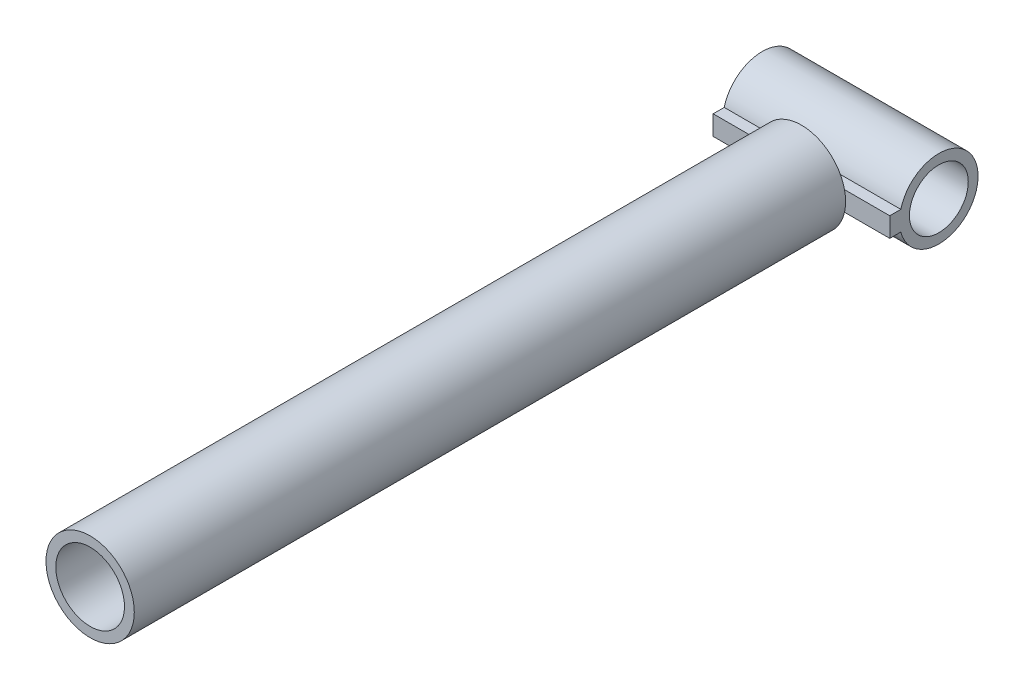
ISO-10303-21;
HEADER;
FILE_DESCRIPTION(('STEP AP214'),'2;1');
FILE_NAME('part.step','',(''),(''),'','','');
FILE_SCHEMA(('AUTOMOTIVE_DESIGN { 1 0 10303 214 1 1 1 1 }'));
ENDSEC;
DATA;
#1=APPLICATION_CONTEXT('core data for automotive mechanical design processes');
#2=APPLICATION_PROTOCOL_DEFINITION('international standard','automotive_design',2000,#1);
#3=PRODUCT_CONTEXT('',#1,'mechanical');
#4=PRODUCT('Part','Part','',(#3));
#5=PRODUCT_RELATED_PRODUCT_CATEGORY('part','',(#4));
#6=PRODUCT_DEFINITION_FORMATION('','',#4);
#7=PRODUCT_DEFINITION_CONTEXT('part definition',#1,'design');
#8=PRODUCT_DEFINITION('design','',#6,#7);
#9=PRODUCT_DEFINITION_SHAPE('','',#8);
#10=(LENGTH_UNIT() NAMED_UNIT(*) SI_UNIT(.MILLI.,.METRE.));
#11=(NAMED_UNIT(*) PLANE_ANGLE_UNIT() SI_UNIT($,.RADIAN.));
#12=(NAMED_UNIT(*) SI_UNIT($,.STERADIAN.) SOLID_ANGLE_UNIT());
#13=UNCERTAINTY_MEASURE_WITH_UNIT(LENGTH_MEASURE(1.E-05),#10,'distance_accuracy_value','');
#14=(GEOMETRIC_REPRESENTATION_CONTEXT(3) GLOBAL_UNCERTAINTY_ASSIGNED_CONTEXT((#13)) GLOBAL_UNIT_ASSIGNED_CONTEXT((#10,
#11,#12)) REPRESENTATION_CONTEXT('',''));
#15=CARTESIAN_POINT('',(0.,0.,0.));
#16=DIRECTION('',(0.,0.,1.));
#17=DIRECTION('',(1.,0.,0.));
#18=AXIS2_PLACEMENT_3D('',#15,#16,#17);
#19=CARTESIAN_POINT('',(0.,0.,0.));
#20=DIRECTION('',(0.,0.,1.));
#21=DIRECTION('',(1.,0.,0.));
#22=AXIS2_PLACEMENT_3D('',#19,#20,#21);
#23=PLANE('',#22);
#24=DIRECTION('',(-1.,0.,0.));
#25=VECTOR('',#24,1.);
#26=CARTESIAN_POINT('',(90.,-10.,0.));
#27=LINE('',#26,#25);
#28=CARTESIAN_POINT('',(43.8748219369606,-10.,0.));
#29=VERTEX_POINT('',#28);
#30=CARTESIAN_POINT('',(-43.8748219369606,-10.,0.));
#31=VERTEX_POINT('',#30);
#32=EDGE_CURVE('E11',#29,#31,#27,.T.);
#33=ORIENTED_EDGE('',*,*,#32,.F.);
#34=CARTESIAN_POINT('',(0.,0.,0.));
#35=DIRECTION('',(0.,0.,1.));
#36=DIRECTION('',(1.,0.,0.));
#37=AXIS2_PLACEMENT_3D('',#34,#35,#36);
#38=CIRCLE('',#37,45.);
#39=EDGE_CURVE('E115',#31,#29,#38,.T.);
#40=ORIENTED_EDGE('',*,*,#39,.F.);
#41=EDGE_LOOP('',(#33,#40));
#42=FACE_BOUND('',#41,.T.);
#43=ADVANCED_FACE('F17',(#42),#23,.F.);
#44=CARTESIAN_POINT('',(0.,0.,725.));
#45=DIRECTION('',(0.,0.,-1.));
#46=DIRECTION('',(-1.,0.,0.));
#47=AXIS2_PLACEMENT_3D('',#44,#45,#46);
#48=CYLINDRICAL_SURFACE('',#47,45.);
#49=CARTESIAN_POINT('',(0.,0.,725.));
#50=DIRECTION('',(0.,0.,1.));
#51=DIRECTION('',(1.,0.,0.));
#52=AXIS2_PLACEMENT_3D('',#49,#50,#51);
#53=CIRCLE('',#52,45.);
#54=CARTESIAN_POINT('',(45.,0.,725.));
#55=VERTEX_POINT('',#54);
#56=EDGE_CURVE('E104',#55,#55,#53,.T.);
#57=ORIENTED_EDGE('',*,*,#56,.F.);
#58=EDGE_LOOP('',(#57));
#59=FACE_BOUND('',#58,.T.);
#60=CARTESIAN_POINT('',(43.8748219369606,10.,0.));
#61=VERTEX_POINT('',#60);
#62=CARTESIAN_POINT('',(-43.8748219369606,10.,0.));
#63=VERTEX_POINT('',#62);
#64=EDGE_CURVE('E21',#61,#63,#38,.T.);
#65=ORIENTED_EDGE('',*,*,#64,.T.);
#66=EDGE_CURVE('E111',#63,#31,#38,.T.);
#67=ORIENTED_EDGE('',*,*,#66,.T.);
#68=ORIENTED_EDGE('',*,*,#39,.T.);
#69=EDGE_CURVE('E95',#29,#61,#38,.T.);
#70=ORIENTED_EDGE('',*,*,#69,.T.);
#71=EDGE_LOOP('',(#65,#67,#68,#70));
#72=FACE_BOUND('',#71,.T.);
#73=ADVANCED_FACE('F19',(#59,#72),#48,.T.);
#74=CARTESIAN_POINT('',(0.,0.,725.));
#75=DIRECTION('',(0.,0.,1.));
#76=DIRECTION('',(1.,0.,0.));
#77=AXIS2_PLACEMENT_3D('',#74,#75,#76);
#78=PLANE('',#77);
#79=CARTESIAN_POINT('',(0.,0.,725.));
#80=DIRECTION('',(0.,0.,1.));
#81=DIRECTION('',(1.,0.,0.));
#82=AXIS2_PLACEMENT_3D('',#79,#80,#81);
#83=CIRCLE('',#82,35.);
#84=CARTESIAN_POINT('',(35.,0.,725.));
#85=VERTEX_POINT('',#84);
#86=EDGE_CURVE('E96',#85,#85,#83,.T.);
#87=ORIENTED_EDGE('',*,*,#86,.F.);
#88=EDGE_LOOP('',(#87));
#89=FACE_BOUND('',#88,.T.);
#90=ORIENTED_EDGE('',*,*,#56,.T.);
#91=EDGE_LOOP('',(#90));
#92=FACE_BOUND('',#91,.T.);
#93=ADVANCED_FACE('F169',(#89,#92),#78,.T.);
#94=ORIENTED_EDGE('',*,*,#64,.F.);
#95=DIRECTION('',(-1.,0.,0.));
#96=VECTOR('',#95,1.);
#97=CARTESIAN_POINT('',(90.,10.,0.));
#98=LINE('',#97,#96);
#99=EDGE_CURVE('E26',#61,#63,#98,.T.);
#100=ORIENTED_EDGE('',*,*,#99,.T.);
#101=EDGE_LOOP('',(#94,#100));
#102=FACE_BOUND('',#101,.T.);
#103=ADVANCED_FACE('F164',(#102),#23,.F.);
#104=CARTESIAN_POINT('',(0.,0.,125.));
#105=DIRECTION('',(0.,0.,1.));
#106=DIRECTION('',(1.,0.,0.));
#107=AXIS2_PLACEMENT_3D('',#104,#105,#106);
#108=CYLINDRICAL_SURFACE('',#107,35.);
#109=CARTESIAN_POINT('',(0.,0.,125.));
#110=DIRECTION('',(0.,0.,1.));
#111=DIRECTION('',(1.,0.,0.));
#112=AXIS2_PLACEMENT_3D('',#109,#110,#111);
#113=CIRCLE('',#112,35.);
#114=CARTESIAN_POINT('',(35.,0.,125.));
#115=VERTEX_POINT('',#114);
#116=EDGE_CURVE('E98',#115,#115,#113,.T.);
#117=ORIENTED_EDGE('',*,*,#116,.F.);
#118=EDGE_LOOP('',(#117));
#119=FACE_BOUND('',#118,.T.);
#120=ORIENTED_EDGE('',*,*,#86,.T.);
#121=EDGE_LOOP('',(#120));
#122=FACE_BOUND('',#121,.T.);
#123=ADVANCED_FACE('F173',(#119,#122),#108,.F.);
#124=CARTESIAN_POINT('',(0.,0.,125.));
#125=DIRECTION('',(0.,0.,1.));
#126=DIRECTION('',(1.,0.,0.));
#127=AXIS2_PLACEMENT_3D('',#124,#125,#126);
#128=PLANE('',#127);
#129=ORIENTED_EDGE('',*,*,#116,.T.);
#130=EDGE_LOOP('',(#129));
#131=FACE_BOUND('',#130,.T.);
#132=ADVANCED_FACE('F180',(#131),#128,.T.);
#133=CARTESIAN_POINT('',(90.,10.,0.));
#134=DIRECTION('',(0.,0.,-1.));
#135=DIRECTION('',(-1.,0.,0.));
#136=AXIS2_PLACEMENT_3D('',#133,#134,#135);
#137=PLANE('',#136);
#138=ORIENTED_EDGE('',*,*,#66,.F.);
#139=CARTESIAN_POINT('',(-90.,10.,0.));
#140=VERTEX_POINT('',#139);
#141=EDGE_CURVE('E36',#63,#140,#98,.T.);
#142=ORIENTED_EDGE('',*,*,#141,.T.);
#143=DIRECTION('',(0.,-1.,0.));
#144=VECTOR('',#143,1.);
#145=CARTESIAN_POINT('',(-90.,10.,0.));
#146=LINE('',#145,#144);
#147=CARTESIAN_POINT('',(-90.,-10.,0.));
#148=VERTEX_POINT('',#147);
#149=EDGE_CURVE('E129',#140,#148,#146,.T.);
#150=ORIENTED_EDGE('',*,*,#149,.T.);
#151=EDGE_CURVE('E29',#31,#148,#27,.T.);
#152=ORIENTED_EDGE('',*,*,#151,.F.);
#153=EDGE_LOOP('',(#138,#142,#150,#152));
#154=FACE_BOUND('',#153,.T.);
#155=ADVANCED_FACE('F132',(#154),#137,.F.);
#156=CARTESIAN_POINT('',(90.,0.,-50.));
#157=DIRECTION('',(1.,0.,0.));
#158=DIRECTION('',(0.,0.,-1.));
#159=AXIS2_PLACEMENT_3D('',#156,#157,#158);
#160=PLANE('',#159);
#161=DIRECTION('',(0.,-1.,0.));
#162=VECTOR('',#161,1.);
#163=CARTESIAN_POINT('',(90.,10.,0.));
#164=LINE('',#163,#162);
#165=CARTESIAN_POINT('',(90.,10.,0.));
#166=VERTEX_POINT('',#165);
#167=CARTESIAN_POINT('',(90.,-10.,0.));
#168=VERTEX_POINT('',#167);
#169=EDGE_CURVE('E83',#166,#168,#164,.T.);
#170=ORIENTED_EDGE('',*,*,#169,.T.);
#171=DIRECTION('',(0.,0.,-1.));
#172=VECTOR('',#171,1.);
#173=CARTESIAN_POINT('',(90.,-10.,0.));
#174=LINE('',#173,#172);
#175=CARTESIAN_POINT('',(90.,-10.,-11.2701665379259));
#176=VERTEX_POINT('',#175);
#177=EDGE_CURVE('E73',#168,#176,#174,.T.);
#178=ORIENTED_EDGE('',*,*,#177,.T.);
#179=CARTESIAN_POINT('',(90.,0.,-50.));
#180=DIRECTION('',(1.,0.,0.));
#181=DIRECTION('',(0.,0.,-1.));
#182=AXIS2_PLACEMENT_3D('',#179,#180,#181);
#183=CIRCLE('',#182,40.);
#184=CARTESIAN_POINT('',(90.,10.,-11.2701665379258));
#185=VERTEX_POINT('',#184);
#186=EDGE_CURVE('E82',#176,#185,#183,.T.);
#187=ORIENTED_EDGE('',*,*,#186,.T.);
#188=DIRECTION('',(0.,0.,1.));
#189=VECTOR('',#188,1.);
#190=CARTESIAN_POINT('',(90.,10.,0.));
#191=LINE('',#190,#189);
#192=EDGE_CURVE('E89',#185,#166,#191,.T.);
#193=ORIENTED_EDGE('',*,*,#192,.T.);
#194=EDGE_LOOP('',(#170,#178,#187,#193));
#195=FACE_BOUND('',#194,.T.);
#196=CARTESIAN_POINT('',(90.,0.,-50.));
#197=DIRECTION('',(1.,0.,0.));
#198=DIRECTION('',(0.,0.,-1.));
#199=AXIS2_PLACEMENT_3D('',#196,#197,#198);
#200=CIRCLE('',#199,30.);
#201=CARTESIAN_POINT('',(90.,0.,-80.));
#202=VERTEX_POINT('',#201);
#203=EDGE_CURVE('E133',#202,#202,#200,.T.);
#204=ORIENTED_EDGE('',*,*,#203,.F.);
#205=EDGE_LOOP('',(#204));
#206=FACE_BOUND('',#205,.T.);
#207=ADVANCED_FACE('F86',(#195,#206),#160,.T.);
#208=CARTESIAN_POINT('',(-90.,0.,-50.));
#209=DIRECTION('',(1.,0.,0.));
#210=DIRECTION('',(0.,0.,-1.));
#211=AXIS2_PLACEMENT_3D('',#208,#209,#210);
#212=PLANE('',#211);
#213=ORIENTED_EDGE('',*,*,#149,.F.);
#214=DIRECTION('',(0.,0.,1.));
#215=VECTOR('',#214,1.);
#216=CARTESIAN_POINT('',(-90.,10.,0.));
#217=LINE('',#216,#215);
#218=CARTESIAN_POINT('',(-90.,10.,-11.2701665379258));
#219=VERTEX_POINT('',#218);
#220=EDGE_CURVE('E91',#219,#140,#217,.T.);
#221=ORIENTED_EDGE('',*,*,#220,.F.);
#222=CARTESIAN_POINT('',(-90.,0.,-50.));
#223=DIRECTION('',(1.,0.,0.));
#224=DIRECTION('',(0.,0.,-1.));
#225=AXIS2_PLACEMENT_3D('',#222,#223,#224);
#226=CIRCLE('',#225,40.);
#227=CARTESIAN_POINT('',(-90.,-10.,-11.2701665379259));
#228=VERTEX_POINT('',#227);
#229=EDGE_CURVE('E130',#228,#219,#226,.T.);
#230=ORIENTED_EDGE('',*,*,#229,.F.);
#231=DIRECTION('',(0.,0.,-1.));
#232=VECTOR('',#231,1.);
#233=CARTESIAN_POINT('',(-90.,-10.,0.));
#234=LINE('',#233,#232);
#235=EDGE_CURVE('E120',#148,#228,#234,.T.);
#236=ORIENTED_EDGE('',*,*,#235,.F.);
#237=EDGE_LOOP('',(#213,#221,#230,#236));
#238=FACE_BOUND('',#237,.T.);
#239=CARTESIAN_POINT('',(-90.,0.,-50.));
#240=DIRECTION('',(1.,0.,0.));
#241=DIRECTION('',(0.,0.,-1.));
#242=AXIS2_PLACEMENT_3D('',#239,#240,#241);
#243=CIRCLE('',#242,30.);
#244=CARTESIAN_POINT('',(-90.,0.,-80.));
#245=VERTEX_POINT('',#244);
#246=EDGE_CURVE('E136',#245,#245,#243,.T.);
#247=ORIENTED_EDGE('',*,*,#246,.T.);
#248=EDGE_LOOP('',(#247));
#249=FACE_BOUND('',#248,.T.);
#250=ADVANCED_FACE('F126',(#238,#249),#212,.F.);
#251=ORIENTED_EDGE('',*,*,#69,.F.);
#252=EDGE_CURVE('E28',#168,#29,#27,.T.);
#253=ORIENTED_EDGE('',*,*,#252,.F.);
#254=ORIENTED_EDGE('',*,*,#169,.F.);
#255=EDGE_CURVE('E109',#166,#61,#98,.T.);
#256=ORIENTED_EDGE('',*,*,#255,.T.);
#257=EDGE_LOOP('',(#251,#253,#254,#256));
#258=FACE_BOUND('',#257,.T.);
#259=ADVANCED_FACE('F93',(#258),#137,.F.);
#260=CARTESIAN_POINT('',(90.,-10.,0.));
#261=DIRECTION('',(0.,1.,0.));
#262=DIRECTION('',(0.,0.,1.));
#263=AXIS2_PLACEMENT_3D('',#260,#261,#262);
#264=PLANE('',#263);
#265=ORIENTED_EDGE('',*,*,#235,.T.);
#266=DIRECTION('',(-1.,0.,0.));
#267=VECTOR('',#266,1.);
#268=CARTESIAN_POINT('',(90.,-10.,-11.2701665379259));
#269=LINE('',#268,#267);
#270=EDGE_CURVE('E79',#176,#228,#269,.T.);
#271=ORIENTED_EDGE('',*,*,#270,.F.);
#272=ORIENTED_EDGE('',*,*,#177,.F.);
#273=ORIENTED_EDGE('',*,*,#252,.T.);
#274=ORIENTED_EDGE('',*,*,#32,.T.);
#275=ORIENTED_EDGE('',*,*,#151,.T.);
#276=EDGE_LOOP('',(#265,#271,#272,#273,#274,#275));
#277=FACE_BOUND('',#276,.T.);
#278=ADVANCED_FACE('F75',(#277),#264,.F.);
#279=CARTESIAN_POINT('',(90.,0.,-50.));
#280=DIRECTION('',(-1.,0.,0.));
#281=DIRECTION('',(0.,0.,1.));
#282=AXIS2_PLACEMENT_3D('',#279,#280,#281);
#283=CYLINDRICAL_SURFACE('',#282,40.);
#284=ORIENTED_EDGE('',*,*,#229,.T.);
#285=DIRECTION('',(-1.,0.,0.));
#286=VECTOR('',#285,1.);
#287=CARTESIAN_POINT('',(90.,10.,-11.2701665379258));
#288=LINE('',#287,#286);
#289=EDGE_CURVE('E142',#185,#219,#288,.T.);
#290=ORIENTED_EDGE('',*,*,#289,.F.);
#291=ORIENTED_EDGE('',*,*,#186,.F.);
#292=ORIENTED_EDGE('',*,*,#270,.T.);
#293=EDGE_LOOP('',(#284,#290,#291,#292));
#294=FACE_BOUND('',#293,.T.);
#295=ADVANCED_FACE('F146',(#294),#283,.T.);
#296=CARTESIAN_POINT('',(90.,10.,0.));
#297=DIRECTION('',(0.,-1.,0.));
#298=DIRECTION('',(0.,0.,-1.));
#299=AXIS2_PLACEMENT_3D('',#296,#297,#298);
#300=PLANE('',#299);
#301=ORIENTED_EDGE('',*,*,#220,.T.);
#302=ORIENTED_EDGE('',*,*,#141,.F.);
#303=ORIENTED_EDGE('',*,*,#99,.F.);
#304=ORIENTED_EDGE('',*,*,#255,.F.);
#305=ORIENTED_EDGE('',*,*,#192,.F.);
#306=ORIENTED_EDGE('',*,*,#289,.T.);
#307=EDGE_LOOP('',(#301,#302,#303,#304,#305,#306));
#308=FACE_BOUND('',#307,.T.);
#309=ADVANCED_FACE('F153',(#308),#300,.F.);
#310=CARTESIAN_POINT('',(90.,0.,-50.));
#311=DIRECTION('',(-1.,0.,0.));
#312=DIRECTION('',(0.,0.,1.));
#313=AXIS2_PLACEMENT_3D('',#310,#311,#312);
#314=CYLINDRICAL_SURFACE('',#313,30.);
#315=ORIENTED_EDGE('',*,*,#203,.T.);
#316=EDGE_LOOP('',(#315));
#317=FACE_BOUND('',#316,.T.);
#318=ORIENTED_EDGE('',*,*,#246,.F.);
#319=EDGE_LOOP('',(#318));
#320=FACE_BOUND('',#319,.T.);
#321=ADVANCED_FACE('F151',(#317,#320),#314,.F.);
#322=CLOSED_SHELL('',(#43,#73,#93,#103,#123,#132,#155,#207,#250,#259,#278,#295,#309,#321));
#323=MANIFOLD_SOLID_BREP('B1',#322);
#324=ADVANCED_BREP_SHAPE_REPRESENTATION('',(#18,#323),#14);
#325=SHAPE_DEFINITION_REPRESENTATION(#9,#324);
ENDSEC;
END-ISO-10303-21;
